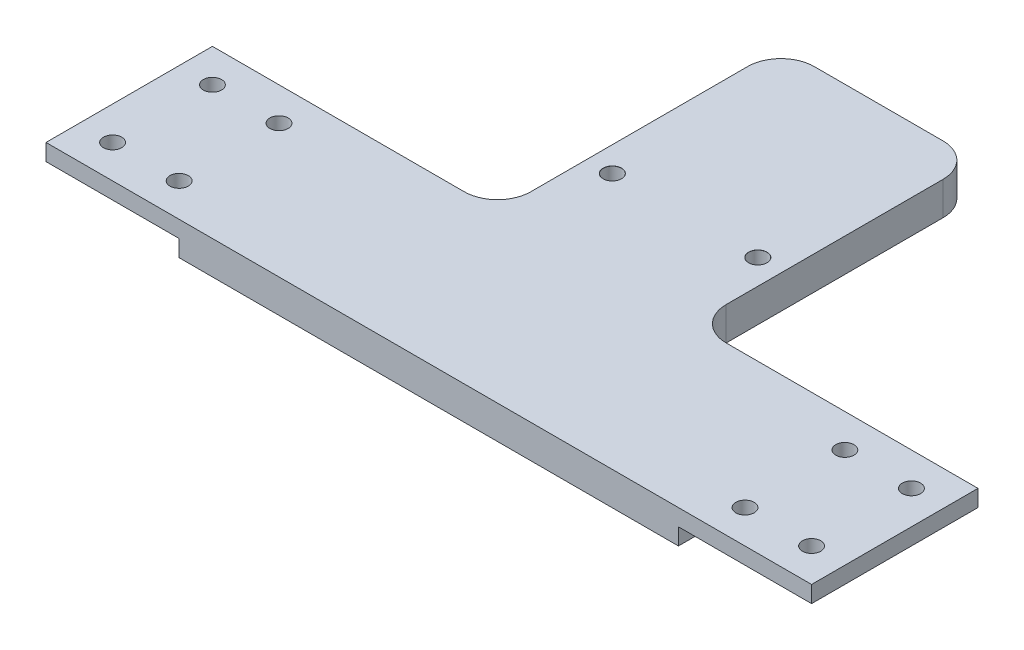
ISO-10303-21;
HEADER;
FILE_DESCRIPTION(('STEP AP214'),'2;1');
FILE_NAME('part.step','',(''),(''),'','','');
FILE_SCHEMA(('AUTOMOTIVE_DESIGN { 1 0 10303 214 1 1 1 1 }'));
ENDSEC;
DATA;
#1=APPLICATION_CONTEXT('core data for automotive mechanical design processes');
#2=APPLICATION_PROTOCOL_DEFINITION('international standard','automotive_design',2000,#1);
#3=PRODUCT_CONTEXT('',#1,'mechanical');
#4=PRODUCT('Part','Part','',(#3));
#5=PRODUCT_RELATED_PRODUCT_CATEGORY('part','',(#4));
#6=PRODUCT_DEFINITION_FORMATION('','',#4);
#7=PRODUCT_DEFINITION_CONTEXT('part definition',#1,'design');
#8=PRODUCT_DEFINITION('design','',#6,#7);
#9=PRODUCT_DEFINITION_SHAPE('','',#8);
#10=(LENGTH_UNIT() NAMED_UNIT(*) SI_UNIT(.MILLI.,.METRE.));
#11=(NAMED_UNIT(*) PLANE_ANGLE_UNIT() SI_UNIT($,.RADIAN.));
#12=(NAMED_UNIT(*) SI_UNIT($,.STERADIAN.) SOLID_ANGLE_UNIT());
#13=UNCERTAINTY_MEASURE_WITH_UNIT(LENGTH_MEASURE(1.E-05),#10,'distance_accuracy_value','');
#14=(GEOMETRIC_REPRESENTATION_CONTEXT(3) GLOBAL_UNCERTAINTY_ASSIGNED_CONTEXT((#13)) GLOBAL_UNIT_ASSIGNED_CONTEXT((#10,
#11,#12)) REPRESENTATION_CONTEXT('',''));
#15=CARTESIAN_POINT('',(0.,0.,0.));
#16=DIRECTION('',(0.,0.,1.));
#17=DIRECTION('',(1.,0.,0.));
#18=AXIS2_PLACEMENT_3D('',#15,#16,#17);
#19=CARTESIAN_POINT('',(-115.,10.,0.));
#20=DIRECTION('',(1.,0.,0.));
#21=DIRECTION('',(0.,0.,-1.));
#22=AXIS2_PLACEMENT_3D('',#19,#20,#21);
#23=PLANE('',#22);
#24=DIRECTION('',(0.,0.,-1.));
#25=VECTOR('',#24,1.);
#26=CARTESIAN_POINT('',(-115.,5.,25.));
#27=LINE('',#26,#25);
#28=CARTESIAN_POINT('',(-115.,5.,25.));
#29=VERTEX_POINT('',#28);
#30=CARTESIAN_POINT('',(-115.,5.,-25.));
#31=VERTEX_POINT('',#30);
#32=EDGE_CURVE('E155',#29,#31,#27,.T.);
#33=ORIENTED_EDGE('',*,*,#32,.F.);
#34=DIRECTION('',(0.,-1.,0.));
#35=VECTOR('',#34,1.);
#36=CARTESIAN_POINT('',(-115.,10.,25.));
#37=LINE('',#36,#35);
#38=CARTESIAN_POINT('',(-115.,10.,25.));
#39=VERTEX_POINT('',#38);
#40=EDGE_CURVE('E181',#39,#29,#37,.T.);
#41=ORIENTED_EDGE('',*,*,#40,.F.);
#42=DIRECTION('',(0.,0.,1.));
#43=VECTOR('',#42,1.);
#44=CARTESIAN_POINT('',(-115.,10.,0.));
#45=LINE('',#44,#43);
#46=CARTESIAN_POINT('',(-115.,10.,-25.));
#47=VERTEX_POINT('',#46);
#48=EDGE_CURVE('E178',#47,#39,#45,.T.);
#49=ORIENTED_EDGE('',*,*,#48,.F.);
#50=DIRECTION('',(0.,-1.,0.));
#51=VECTOR('',#50,1.);
#52=CARTESIAN_POINT('',(-115.,10.,-25.));
#53=LINE('',#52,#51);
#54=EDGE_CURVE('E172',#47,#31,#53,.T.);
#55=ORIENTED_EDGE('',*,*,#54,.T.);
#56=EDGE_LOOP('',(#33,#41,#49,#55));
#57=FACE_BOUND('',#56,.T.);
#58=ADVANCED_FACE('F41',(#57),#23,.F.);
#59=CARTESIAN_POINT('',(-29.35,10.,0.));
#60=DIRECTION('',(-1.,0.,0.));
#61=DIRECTION('',(0.,0.,1.));
#62=AXIS2_PLACEMENT_3D('',#59,#60,#61);
#63=PLANE('',#62);
#64=DIRECTION('',(0.,0.,-1.));
#65=VECTOR('',#64,1.);
#66=CARTESIAN_POINT('',(-29.35,0.,0.));
#67=LINE('',#66,#65);
#68=CARTESIAN_POINT('',(-29.35,0.,-35.));
#69=VERTEX_POINT('',#68);
#70=CARTESIAN_POINT('',(-29.35,0.,-100.15));
#71=VERTEX_POINT('',#70);
#72=EDGE_CURVE('E257',#69,#71,#67,.T.);
#73=ORIENTED_EDGE('',*,*,#72,.F.);
#74=DIRECTION('',(0.,-1.,0.));
#75=VECTOR('',#74,1.);
#76=CARTESIAN_POINT('',(-29.35,10.,-35.));
#77=LINE('',#76,#75);
#78=CARTESIAN_POINT('',(-29.35,10.,-35.));
#79=VERTEX_POINT('',#78);
#80=EDGE_CURVE('E192',#69,#79,#77,.F.);
#81=ORIENTED_EDGE('',*,*,#80,.T.);
#82=DIRECTION('',(0.,0.,-1.));
#83=VECTOR('',#82,1.);
#84=CARTESIAN_POINT('',(-29.35,10.,0.));
#85=LINE('',#84,#83);
#86=CARTESIAN_POINT('',(-29.35,10.,-100.15));
#87=VERTEX_POINT('',#86);
#88=EDGE_CURVE('E267',#79,#87,#85,.T.);
#89=ORIENTED_EDGE('',*,*,#88,.T.);
#90=DIRECTION('',(0.,-1.,0.));
#91=VECTOR('',#90,1.);
#92=CARTESIAN_POINT('',(-29.35,10.,-100.15));
#93=LINE('',#92,#91);
#94=EDGE_CURVE('E184',#87,#71,#93,.T.);
#95=ORIENTED_EDGE('',*,*,#94,.T.);
#96=EDGE_LOOP('',(#73,#81,#89,#95));
#97=FACE_BOUND('',#96,.T.);
#98=ADVANCED_FACE('F339',(#97),#63,.T.);
#99=CARTESIAN_POINT('',(0.,10.,-25.));
#100=DIRECTION('',(0.,0.,-1.));
#101=DIRECTION('',(-1.,0.,0.));
#102=AXIS2_PLACEMENT_3D('',#99,#100,#101);
#103=PLANE('',#102);
#104=DIRECTION('',(1.,0.,0.));
#105=VECTOR('',#104,1.);
#106=CARTESIAN_POINT('',(0.,10.,-25.));
#107=LINE('',#106,#105);
#108=CARTESIAN_POINT('',(-39.35,10.,-25.));
#109=VERTEX_POINT('',#108);
#110=EDGE_CURVE('E253',#47,#109,#107,.T.);
#111=ORIENTED_EDGE('',*,*,#110,.T.);
#112=DIRECTION('',(0.,-1.,0.));
#113=VECTOR('',#112,1.);
#114=CARTESIAN_POINT('',(-39.35,0.,-25.));
#115=LINE('',#114,#113);
#116=CARTESIAN_POINT('',(-39.35,0.,-25.));
#117=VERTEX_POINT('',#116);
#118=EDGE_CURVE('E180',#109,#117,#115,.T.);
#119=ORIENTED_EDGE('',*,*,#118,.T.);
#120=DIRECTION('',(1.,0.,0.));
#121=VECTOR('',#120,1.);
#122=CARTESIAN_POINT('',(0.,0.,-25.));
#123=LINE('',#122,#121);
#124=CARTESIAN_POINT('',(-75.,0.,-25.));
#125=VERTEX_POINT('',#124);
#126=EDGE_CURVE('E236',#125,#117,#123,.T.);
#127=ORIENTED_EDGE('',*,*,#126,.F.);
#128=DIRECTION('',(0.,-1.,0.));
#129=VECTOR('',#128,1.);
#130=CARTESIAN_POINT('',(-75.,5.,-25.));
#131=LINE('',#130,#129);
#132=CARTESIAN_POINT('',(-75.,5.,-25.));
#133=VERTEX_POINT('',#132);
#134=EDGE_CURVE('E175',#133,#125,#131,.T.);
#135=ORIENTED_EDGE('',*,*,#134,.F.);
#136=DIRECTION('',(1.,0.,0.));
#137=VECTOR('',#136,1.);
#138=CARTESIAN_POINT('',(-115.,5.,-25.));
#139=LINE('',#138,#137);
#140=EDGE_CURVE('E159',#31,#133,#139,.T.);
#141=ORIENTED_EDGE('',*,*,#140,.F.);
#142=ORIENTED_EDGE('',*,*,#54,.F.);
#143=EDGE_LOOP('',(#111,#119,#127,#135,#141,#142));
#144=FACE_BOUND('',#143,.T.);
#145=ADVANCED_FACE('F171',(#144),#103,.T.);
#146=CARTESIAN_POINT('',(0.,10.,25.));
#147=DIRECTION('',(0.,0.,-1.));
#148=DIRECTION('',(-1.,0.,0.));
#149=AXIS2_PLACEMENT_3D('',#146,#147,#148);
#150=PLANE('',#149);
#151=DIRECTION('',(-1.,0.,0.));
#152=VECTOR('',#151,1.);
#153=CARTESIAN_POINT('',(-115.,5.,25.));
#154=LINE('',#153,#152);
#155=CARTESIAN_POINT('',(-75.,5.,25.));
#156=VERTEX_POINT('',#155);
#157=EDGE_CURVE('E162',#156,#29,#154,.T.);
#158=ORIENTED_EDGE('',*,*,#157,.F.);
#159=DIRECTION('',(0.,-1.,0.));
#160=VECTOR('',#159,1.);
#161=CARTESIAN_POINT('',(-75.,5.,25.));
#162=LINE('',#161,#160);
#163=CARTESIAN_POINT('',(-75.,0.,25.));
#164=VERTEX_POINT('',#163);
#165=EDGE_CURVE('E300',#156,#164,#162,.T.);
#166=ORIENTED_EDGE('',*,*,#165,.T.);
#167=DIRECTION('',(1.,0.,0.));
#168=VECTOR('',#167,1.);
#169=CARTESIAN_POINT('',(0.,0.,25.));
#170=LINE('',#169,#168);
#171=CARTESIAN_POINT('',(75.,0.,25.));
#172=VERTEX_POINT('',#171);
#173=EDGE_CURVE('E234',#164,#172,#170,.T.);
#174=ORIENTED_EDGE('',*,*,#173,.T.);
#175=DIRECTION('',(0.,-1.,0.));
#176=VECTOR('',#175,1.);
#177=CARTESIAN_POINT('',(75.,5.,25.));
#178=LINE('',#177,#176);
#179=CARTESIAN_POINT('',(75.,5.,25.));
#180=VERTEX_POINT('',#179);
#181=EDGE_CURVE('E285',#180,#172,#178,.T.);
#182=ORIENTED_EDGE('',*,*,#181,.F.);
#183=DIRECTION('',(-1.,0.,0.));
#184=VECTOR('',#183,1.);
#185=CARTESIAN_POINT('',(115.,5.,25.));
#186=LINE('',#185,#184);
#187=CARTESIAN_POINT('',(115.,5.,25.));
#188=VERTEX_POINT('',#187);
#189=EDGE_CURVE('E284',#188,#180,#186,.T.);
#190=ORIENTED_EDGE('',*,*,#189,.F.);
#191=DIRECTION('',(0.,-1.,0.));
#192=VECTOR('',#191,1.);
#193=CARTESIAN_POINT('',(115.,10.,25.));
#194=LINE('',#193,#192);
#195=CARTESIAN_POINT('',(115.,10.,25.));
#196=VERTEX_POINT('',#195);
#197=EDGE_CURVE('E186',#196,#188,#194,.T.);
#198=ORIENTED_EDGE('',*,*,#197,.F.);
#199=DIRECTION('',(1.,0.,0.));
#200=VECTOR('',#199,1.);
#201=CARTESIAN_POINT('',(0.,10.,25.));
#202=LINE('',#201,#200);
#203=EDGE_CURVE('E281',#39,#196,#202,.T.);
#204=ORIENTED_EDGE('',*,*,#203,.F.);
#205=ORIENTED_EDGE('',*,*,#40,.T.);
#206=EDGE_LOOP('',(#158,#166,#174,#182,#190,#198,#204,#205));
#207=FACE_BOUND('',#206,.T.);
#208=ADVANCED_FACE('F280',(#207),#150,.F.);
#209=CARTESIAN_POINT('',(115.,10.,0.));
#210=DIRECTION('',(1.,0.,0.));
#211=DIRECTION('',(0.,0.,-1.));
#212=AXIS2_PLACEMENT_3D('',#209,#210,#211);
#213=PLANE('',#212);
#214=DIRECTION('',(0.,0.,1.));
#215=VECTOR('',#214,1.);
#216=CARTESIAN_POINT('',(115.,5.,25.));
#217=LINE('',#216,#215);
#218=CARTESIAN_POINT('',(115.,5.,-25.));
#219=VERTEX_POINT('',#218);
#220=EDGE_CURVE('E276',#219,#188,#217,.T.);
#221=ORIENTED_EDGE('',*,*,#220,.F.);
#222=DIRECTION('',(0.,-1.,0.));
#223=VECTOR('',#222,1.);
#224=CARTESIAN_POINT('',(115.,10.,-25.));
#225=LINE('',#224,#223);
#226=CARTESIAN_POINT('',(115.,10.,-25.));
#227=VERTEX_POINT('',#226);
#228=EDGE_CURVE('E249',#227,#219,#225,.T.);
#229=ORIENTED_EDGE('',*,*,#228,.F.);
#230=DIRECTION('',(0.,0.,1.));
#231=VECTOR('',#230,1.);
#232=CARTESIAN_POINT('',(115.,10.,0.));
#233=LINE('',#232,#231);
#234=EDGE_CURVE('E251',#227,#196,#233,.T.);
#235=ORIENTED_EDGE('',*,*,#234,.T.);
#236=ORIENTED_EDGE('',*,*,#197,.T.);
#237=EDGE_LOOP('',(#221,#229,#235,#236));
#238=FACE_BOUND('',#237,.T.);
#239=ADVANCED_FACE('F274',(#238),#213,.T.);
#240=CARTESIAN_POINT('',(39.35,0.,-25.));
#241=VERTEX_POINT('',#240);
#242=CARTESIAN_POINT('',(75.,0.,-25.));
#243=VERTEX_POINT('',#242);
#244=EDGE_CURVE('E221',#241,#243,#123,.T.);
#245=ORIENTED_EDGE('',*,*,#244,.F.);
#246=DIRECTION('',(0.,-1.,0.));
#247=VECTOR('',#246,1.);
#248=CARTESIAN_POINT('',(39.35,10.,-25.));
#249=LINE('',#248,#247);
#250=CARTESIAN_POINT('',(39.35,10.,-25.));
#251=VERTEX_POINT('',#250);
#252=EDGE_CURVE('E199',#241,#251,#249,.F.);
#253=ORIENTED_EDGE('',*,*,#252,.T.);
#254=EDGE_CURVE('E243',#251,#227,#107,.T.);
#255=ORIENTED_EDGE('',*,*,#254,.T.);
#256=ORIENTED_EDGE('',*,*,#228,.T.);
#257=DIRECTION('',(1.,0.,0.));
#258=VECTOR('',#257,1.);
#259=CARTESIAN_POINT('',(115.,5.,-25.));
#260=LINE('',#259,#258);
#261=CARTESIAN_POINT('',(75.,5.,-25.));
#262=VERTEX_POINT('',#261);
#263=EDGE_CURVE('E292',#262,#219,#260,.T.);
#264=ORIENTED_EDGE('',*,*,#263,.F.);
#265=DIRECTION('',(0.,-1.,0.));
#266=VECTOR('',#265,1.);
#267=CARTESIAN_POINT('',(75.,5.,-25.));
#268=LINE('',#267,#266);
#269=EDGE_CURVE('E233',#262,#243,#268,.T.);
#270=ORIENTED_EDGE('',*,*,#269,.T.);
#271=EDGE_LOOP('',(#245,#253,#255,#256,#264,#270));
#272=FACE_BOUND('',#271,.T.);
#273=ADVANCED_FACE('F230',(#272),#103,.T.);
#274=CARTESIAN_POINT('',(29.35,10.,0.));
#275=DIRECTION('',(-1.,0.,0.));
#276=DIRECTION('',(0.,0.,1.));
#277=AXIS2_PLACEMENT_3D('',#274,#275,#276);
#278=PLANE('',#277);
#279=DIRECTION('',(0.,0.,-1.));
#280=VECTOR('',#279,1.);
#281=CARTESIAN_POINT('',(29.35,10.,0.));
#282=LINE('',#281,#280);
#283=CARTESIAN_POINT('',(29.35,10.,-35.));
#284=VERTEX_POINT('',#283);
#285=CARTESIAN_POINT('',(29.35,10.,-100.15));
#286=VERTEX_POINT('',#285);
#287=EDGE_CURVE('E241',#284,#286,#282,.T.);
#288=ORIENTED_EDGE('',*,*,#287,.F.);
#289=DIRECTION('',(0.,-1.,0.));
#290=VECTOR('',#289,1.);
#291=CARTESIAN_POINT('',(29.35,10.,-35.));
#292=LINE('',#291,#290);
#293=CARTESIAN_POINT('',(29.35,0.,-35.));
#294=VERTEX_POINT('',#293);
#295=EDGE_CURVE('E196',#284,#294,#292,.T.);
#296=ORIENTED_EDGE('',*,*,#295,.T.);
#297=DIRECTION('',(0.,0.,-1.));
#298=VECTOR('',#297,1.);
#299=CARTESIAN_POINT('',(29.35,0.,0.));
#300=LINE('',#299,#298);
#301=CARTESIAN_POINT('',(29.35,0.,-100.15));
#302=VERTEX_POINT('',#301);
#303=EDGE_CURVE('E224',#294,#302,#300,.T.);
#304=ORIENTED_EDGE('',*,*,#303,.T.);
#305=DIRECTION('',(0.,-1.,0.));
#306=VECTOR('',#305,1.);
#307=CARTESIAN_POINT('',(29.35,10.,-100.15));
#308=LINE('',#307,#306);
#309=EDGE_CURVE('E194',#302,#286,#308,.F.);
#310=ORIENTED_EDGE('',*,*,#309,.T.);
#311=EDGE_LOOP('',(#288,#296,#304,#310));
#312=FACE_BOUND('',#311,.T.);
#313=ADVANCED_FACE('F245',(#312),#278,.F.);
#314=CARTESIAN_POINT('',(0.,10.,-110.15));
#315=DIRECTION('',(0.,0.,-1.));
#316=DIRECTION('',(-1.,0.,0.));
#317=AXIS2_PLACEMENT_3D('',#314,#315,#316);
#318=PLANE('',#317);
#319=DIRECTION('',(1.,0.,0.));
#320=VECTOR('',#319,1.);
#321=CARTESIAN_POINT('',(0.,10.,-110.15));
#322=LINE('',#321,#320);
#323=CARTESIAN_POINT('',(-19.35,10.,-110.15));
#324=VERTEX_POINT('',#323);
#325=CARTESIAN_POINT('',(19.35,10.,-110.15));
#326=VERTEX_POINT('',#325);
#327=EDGE_CURVE('E247',#324,#326,#322,.T.);
#328=ORIENTED_EDGE('',*,*,#327,.T.);
#329=DIRECTION('',(0.,-1.,0.));
#330=VECTOR('',#329,1.);
#331=CARTESIAN_POINT('',(19.35,0.,-110.15));
#332=LINE('',#331,#330);
#333=CARTESIAN_POINT('',(19.35,0.,-110.15));
#334=VERTEX_POINT('',#333);
#335=EDGE_CURVE('E202',#326,#334,#332,.T.);
#336=ORIENTED_EDGE('',*,*,#335,.T.);
#337=DIRECTION('',(1.,0.,0.));
#338=VECTOR('',#337,1.);
#339=CARTESIAN_POINT('',(0.,0.,-110.15));
#340=LINE('',#339,#338);
#341=CARTESIAN_POINT('',(-19.35,0.,-110.15));
#342=VERTEX_POINT('',#341);
#343=EDGE_CURVE('E265',#342,#334,#340,.T.);
#344=ORIENTED_EDGE('',*,*,#343,.F.);
#345=DIRECTION('',(0.,-1.,0.));
#346=VECTOR('',#345,1.);
#347=CARTESIAN_POINT('',(-19.35,10.,-110.15));
#348=LINE('',#347,#346);
#349=EDGE_CURVE('E63',#342,#324,#348,.F.);
#350=ORIENTED_EDGE('',*,*,#349,.T.);
#351=EDGE_LOOP('',(#328,#336,#344,#350));
#352=FACE_BOUND('',#351,.T.);
#353=ADVANCED_FACE('F344',(#352),#318,.T.);
#354=CARTESIAN_POINT('',(0.,10.,0.));
#355=DIRECTION('',(0.,1.,0.));
#356=DIRECTION('',(0.,0.,1.));
#357=AXIS2_PLACEMENT_3D('',#354,#355,#356);
#358=PLANE('',#357);
#359=CARTESIAN_POINT('',(85.,10.,15.));
#360=DIRECTION('',(0.,-1.,0.));
#361=DIRECTION('',(0.,0.,-1.));
#362=AXIS2_PLACEMENT_3D('',#359,#360,#361);
#363=CIRCLE('',#362,2.74999999999999);
#364=CARTESIAN_POINT('',(85.,10.,12.25));
#365=VERTEX_POINT('',#364);
#366=EDGE_CURVE('E724',#365,#365,#363,.T.);
#367=ORIENTED_EDGE('',*,*,#366,.T.);
#368=EDGE_LOOP('',(#367));
#369=FACE_BOUND('',#368,.T.);
#370=CARTESIAN_POINT('',(85.,10.,-15.));
#371=DIRECTION('',(0.,-1.,0.));
#372=DIRECTION('',(0.,0.,-1.));
#373=AXIS2_PLACEMENT_3D('',#370,#371,#372);
#374=CIRCLE('',#373,2.74999999999999);
#375=CARTESIAN_POINT('',(85.,10.,-17.75));
#376=VERTEX_POINT('',#375);
#377=EDGE_CURVE('E728',#376,#376,#374,.T.);
#378=ORIENTED_EDGE('',*,*,#377,.T.);
#379=EDGE_LOOP('',(#378));
#380=FACE_BOUND('',#379,.T.);
#381=CARTESIAN_POINT('',(105.,10.,15.));
#382=DIRECTION('',(0.,-1.,0.));
#383=DIRECTION('',(0.,0.,-1.));
#384=AXIS2_PLACEMENT_3D('',#381,#382,#383);
#385=CIRCLE('',#384,2.74999999999997);
#386=CARTESIAN_POINT('',(105.,10.,12.25));
#387=VERTEX_POINT('',#386);
#388=EDGE_CURVE('E732',#387,#387,#385,.T.);
#389=ORIENTED_EDGE('',*,*,#388,.T.);
#390=EDGE_LOOP('',(#389));
#391=FACE_BOUND('',#390,.T.);
#392=CARTESIAN_POINT('',(105.,10.,-15.));
#393=DIRECTION('',(0.,-1.,0.));
#394=DIRECTION('',(0.,0.,-1.));
#395=AXIS2_PLACEMENT_3D('',#392,#393,#394);
#396=CIRCLE('',#395,2.74999999999997);
#397=CARTESIAN_POINT('',(105.,10.,-17.75));
#398=VERTEX_POINT('',#397);
#399=EDGE_CURVE('E736',#398,#398,#396,.T.);
#400=ORIENTED_EDGE('',*,*,#399,.T.);
#401=EDGE_LOOP('',(#400));
#402=FACE_BOUND('',#401,.T.);
#403=CARTESIAN_POINT('',(-105.,10.,15.));
#404=DIRECTION('',(0.,-1.,0.));
#405=DIRECTION('',(0.,0.,-1.));
#406=AXIS2_PLACEMENT_3D('',#403,#404,#405);
#407=CIRCLE('',#406,2.74999999999997);
#408=CARTESIAN_POINT('',(-105.,10.,12.25));
#409=VERTEX_POINT('',#408);
#410=EDGE_CURVE('E740',#409,#409,#407,.T.);
#411=ORIENTED_EDGE('',*,*,#410,.T.);
#412=EDGE_LOOP('',(#411));
#413=FACE_BOUND('',#412,.T.);
#414=CARTESIAN_POINT('',(-105.,10.,-15.));
#415=DIRECTION('',(0.,-1.,0.));
#416=DIRECTION('',(0.,0.,-1.));
#417=AXIS2_PLACEMENT_3D('',#414,#415,#416);
#418=CIRCLE('',#417,2.74999999999997);
#419=CARTESIAN_POINT('',(-105.,10.,-17.75));
#420=VERTEX_POINT('',#419);
#421=EDGE_CURVE('E744',#420,#420,#418,.T.);
#422=ORIENTED_EDGE('',*,*,#421,.T.);
#423=EDGE_LOOP('',(#422));
#424=FACE_BOUND('',#423,.T.);
#425=CARTESIAN_POINT('',(-85.,10.,15.));
#426=DIRECTION('',(0.,-1.,0.));
#427=DIRECTION('',(0.,0.,-1.));
#428=AXIS2_PLACEMENT_3D('',#425,#426,#427);
#429=CIRCLE('',#428,2.74999999999999);
#430=CARTESIAN_POINT('',(-85.,10.,12.25));
#431=VERTEX_POINT('',#430);
#432=EDGE_CURVE('E748',#431,#431,#429,.T.);
#433=ORIENTED_EDGE('',*,*,#432,.T.);
#434=EDGE_LOOP('',(#433));
#435=FACE_BOUND('',#434,.T.);
#436=CARTESIAN_POINT('',(-85.,10.,-15.));
#437=DIRECTION('',(0.,-1.,0.));
#438=DIRECTION('',(0.,0.,-1.));
#439=AXIS2_PLACEMENT_3D('',#436,#437,#438);
#440=CIRCLE('',#439,2.74999999999999);
#441=CARTESIAN_POINT('',(-85.,10.,-17.75));
#442=VERTEX_POINT('',#441);
#443=EDGE_CURVE('E326',#442,#442,#440,.T.);
#444=ORIENTED_EDGE('',*,*,#443,.T.);
#445=EDGE_LOOP('',(#444));
#446=FACE_BOUND('',#445,.T.);
#447=CARTESIAN_POINT('',(-21.85,10.,-52.));
#448=DIRECTION('',(0.,1.,0.));
#449=DIRECTION('',(0.,0.,1.));
#450=AXIS2_PLACEMENT_3D('',#447,#448,#449);
#451=CIRCLE('',#450,2.775);
#452=CARTESIAN_POINT('',(-21.85,10.,-49.225));
#453=VERTEX_POINT('',#452);
#454=EDGE_CURVE('E296',#453,#453,#451,.T.);
#455=ORIENTED_EDGE('',*,*,#454,.F.);
#456=EDGE_LOOP('',(#455));
#457=FACE_BOUND('',#456,.T.);
#458=CARTESIAN_POINT('',(21.85,10.,-52.));
#459=DIRECTION('',(0.,1.,0.));
#460=DIRECTION('',(0.,0.,1.));
#461=AXIS2_PLACEMENT_3D('',#458,#459,#460);
#462=CIRCLE('',#461,2.775);
#463=CARTESIAN_POINT('',(21.85,10.,-49.225));
#464=VERTEX_POINT('',#463);
#465=EDGE_CURVE('E306',#464,#464,#462,.T.);
#466=ORIENTED_EDGE('',*,*,#465,.F.);
#467=EDGE_LOOP('',(#466));
#468=FACE_BOUND('',#467,.T.);
#469=ORIENTED_EDGE('',*,*,#287,.T.);
#470=CARTESIAN_POINT('',(19.35,10.,-100.15));
#471=DIRECTION('',(0.,1.,0.));
#472=DIRECTION('',(0.,0.,1.));
#473=AXIS2_PLACEMENT_3D('',#470,#471,#472);
#474=CIRCLE('',#473,10.);
#475=EDGE_CURVE('E56',#286,#326,#474,.T.);
#476=ORIENTED_EDGE('',*,*,#475,.T.);
#477=ORIENTED_EDGE('',*,*,#327,.F.);
#478=CARTESIAN_POINT('',(-19.35,10.,-100.15));
#479=DIRECTION('',(0.,1.,0.));
#480=DIRECTION('',(0.,0.,1.));
#481=AXIS2_PLACEMENT_3D('',#478,#479,#480);
#482=CIRCLE('',#481,10.);
#483=EDGE_CURVE('E209',#324,#87,#482,.T.);
#484=ORIENTED_EDGE('',*,*,#483,.T.);
#485=ORIENTED_EDGE('',*,*,#88,.F.);
#486=CARTESIAN_POINT('',(-39.35,10.,-35.));
#487=DIRECTION('',(0.,1.,0.));
#488=DIRECTION('',(0.,0.,1.));
#489=AXIS2_PLACEMENT_3D('',#486,#487,#488);
#490=CIRCLE('',#489,10.);
#491=EDGE_CURVE('E214',#79,#109,#490,.F.);
#492=ORIENTED_EDGE('',*,*,#491,.T.);
#493=ORIENTED_EDGE('',*,*,#110,.F.);
#494=ORIENTED_EDGE('',*,*,#48,.T.);
#495=ORIENTED_EDGE('',*,*,#203,.T.);
#496=ORIENTED_EDGE('',*,*,#234,.F.);
#497=ORIENTED_EDGE('',*,*,#254,.F.);
#498=CARTESIAN_POINT('',(39.35,10.,-35.));
#499=DIRECTION('',(0.,1.,0.));
#500=DIRECTION('',(0.,0.,1.));
#501=AXIS2_PLACEMENT_3D('',#498,#499,#500);
#502=CIRCLE('',#501,10.);
#503=EDGE_CURVE('E11',#251,#284,#502,.F.);
#504=ORIENTED_EDGE('',*,*,#503,.T.);
#505=EDGE_LOOP('',(#469,#476,#477,#484,#485,#492,#493,#494,#495,#496,#497,#504));
#506=FACE_BOUND('',#505,.T.);
#507=ADVANCED_FACE('F240',(#369,#380,#391,#402,#413,#424,#435,#446,#457,#468,#506),#358,.T.);
#508=CARTESIAN_POINT('',(0.,0.,0.));
#509=DIRECTION('',(0.,1.,0.));
#510=DIRECTION('',(0.,0.,1.));
#511=AXIS2_PLACEMENT_3D('',#508,#509,#510);
#512=PLANE('',#511);
#513=CARTESIAN_POINT('',(-21.85,0.,-52.));
#514=DIRECTION('',(0.,1.,0.));
#515=DIRECTION('',(0.,0.,1.));
#516=AXIS2_PLACEMENT_3D('',#513,#514,#515);
#517=CIRCLE('',#516,2.75);
#518=CARTESIAN_POINT('',(-21.85,0.,-49.25));
#519=VERTEX_POINT('',#518);
#520=EDGE_CURVE('E303',#519,#519,#517,.T.);
#521=ORIENTED_EDGE('',*,*,#520,.T.);
#522=EDGE_LOOP('',(#521));
#523=FACE_BOUND('',#522,.T.);
#524=CARTESIAN_POINT('',(21.85,0.,-52.));
#525=DIRECTION('',(0.,1.,0.));
#526=DIRECTION('',(0.,0.,1.));
#527=AXIS2_PLACEMENT_3D('',#524,#525,#526);
#528=CIRCLE('',#527,2.75);
#529=CARTESIAN_POINT('',(21.85,0.,-49.25));
#530=VERTEX_POINT('',#529);
#531=EDGE_CURVE('E259',#530,#530,#528,.T.);
#532=ORIENTED_EDGE('',*,*,#531,.T.);
#533=EDGE_LOOP('',(#532));
#534=FACE_BOUND('',#533,.T.);
#535=ORIENTED_EDGE('',*,*,#343,.T.);
#536=CARTESIAN_POINT('',(19.35,0.,-100.15));
#537=DIRECTION('',(0.,1.,0.));
#538=DIRECTION('',(0.,0.,1.));
#539=AXIS2_PLACEMENT_3D('',#536,#537,#538);
#540=CIRCLE('',#539,10.);
#541=EDGE_CURVE('E207',#334,#302,#540,.F.);
#542=ORIENTED_EDGE('',*,*,#541,.T.);
#543=ORIENTED_EDGE('',*,*,#303,.F.);
#544=CARTESIAN_POINT('',(39.35,0.,-35.));
#545=DIRECTION('',(0.,1.,0.));
#546=DIRECTION('',(0.,0.,1.));
#547=AXIS2_PLACEMENT_3D('',#544,#545,#546);
#548=CIRCLE('',#547,10.);
#549=EDGE_CURVE('E49',#294,#241,#548,.T.);
#550=ORIENTED_EDGE('',*,*,#549,.T.);
#551=ORIENTED_EDGE('',*,*,#244,.T.);
#552=DIRECTION('',(0.,0.,-1.));
#553=VECTOR('',#552,1.);
#554=CARTESIAN_POINT('',(75.,0.,25.));
#555=LINE('',#554,#553);
#556=EDGE_CURVE('E290',#172,#243,#555,.T.);
#557=ORIENTED_EDGE('',*,*,#556,.F.);
#558=ORIENTED_EDGE('',*,*,#173,.F.);
#559=DIRECTION('',(0.,0.,1.));
#560=VECTOR('',#559,1.);
#561=CARTESIAN_POINT('',(-75.,0.,25.));
#562=LINE('',#561,#560);
#563=EDGE_CURVE('E167',#125,#164,#562,.T.);
#564=ORIENTED_EDGE('',*,*,#563,.F.);
#565=ORIENTED_EDGE('',*,*,#126,.T.);
#566=CARTESIAN_POINT('',(-39.35,0.,-35.));
#567=DIRECTION('',(0.,1.,0.));
#568=DIRECTION('',(0.,0.,1.));
#569=AXIS2_PLACEMENT_3D('',#566,#567,#568);
#570=CIRCLE('',#569,10.);
#571=EDGE_CURVE('E212',#117,#69,#570,.T.);
#572=ORIENTED_EDGE('',*,*,#571,.T.);
#573=ORIENTED_EDGE('',*,*,#72,.T.);
#574=CARTESIAN_POINT('',(-19.35,0.,-100.15));
#575=DIRECTION('',(0.,1.,0.));
#576=DIRECTION('',(0.,0.,1.));
#577=AXIS2_PLACEMENT_3D('',#574,#575,#576);
#578=CIRCLE('',#577,10.);
#579=EDGE_CURVE('E205',#71,#342,#578,.F.);
#580=ORIENTED_EDGE('',*,*,#579,.T.);
#581=EDGE_LOOP('',(#535,#542,#543,#550,#551,#557,#558,#564,#565,#572,#573,#580));
#582=FACE_BOUND('',#581,.T.);
#583=ADVANCED_FACE('F219',(#523,#534,#582),#512,.F.);
#584=CARTESIAN_POINT('',(21.85,10.,-52.));
#585=DIRECTION('',(0.,1.,0.));
#586=DIRECTION('',(0.,0.,1.));
#587=AXIS2_PLACEMENT_3D('',#584,#585,#586);
#588=CYLINDRICAL_SURFACE('',#587,2.75);
#589=ORIENTED_EDGE('',*,*,#531,.F.);
#590=EDGE_LOOP('',(#589));
#591=FACE_BOUND('',#590,.T.);
#592=CARTESIAN_POINT('',(21.85,9.975,-52.));
#593=DIRECTION('',(0.,1.,0.));
#594=DIRECTION('',(0.,0.,1.));
#595=AXIS2_PLACEMENT_3D('',#592,#593,#594);
#596=CIRCLE('',#595,2.75);
#597=CARTESIAN_POINT('',(21.85,9.975,-49.25));
#598=VERTEX_POINT('',#597);
#599=EDGE_CURVE('E309',#598,#598,#596,.T.);
#600=ORIENTED_EDGE('',*,*,#599,.T.);
#601=EDGE_LOOP('',(#600));
#602=FACE_BOUND('',#601,.T.);
#603=ADVANCED_FACE('F459',(#591,#602),#588,.F.);
#604=CARTESIAN_POINT('',(21.85,10.,-52.));
#605=DIRECTION('',(0.,1.,0.));
#606=DIRECTION('',(0.,0.,1.));
#607=AXIS2_PLACEMENT_3D('',#604,#605,#606);
#608=CONICAL_SURFACE('',#607,2.775,0.785398163397448);
#609=ORIENTED_EDGE('',*,*,#599,.F.);
#610=EDGE_LOOP('',(#609));
#611=FACE_BOUND('',#610,.T.);
#612=ORIENTED_EDGE('',*,*,#465,.T.);
#613=EDGE_LOOP('',(#612));
#614=FACE_BOUND('',#613,.T.);
#615=ADVANCED_FACE('F455',(#611,#614),#608,.F.);
#616=CARTESIAN_POINT('',(-21.85,10.,-52.));
#617=DIRECTION('',(0.,1.,0.));
#618=DIRECTION('',(0.,0.,1.));
#619=AXIS2_PLACEMENT_3D('',#616,#617,#618);
#620=CYLINDRICAL_SURFACE('',#619,2.75);
#621=ORIENTED_EDGE('',*,*,#520,.F.);
#622=EDGE_LOOP('',(#621));
#623=FACE_BOUND('',#622,.T.);
#624=CARTESIAN_POINT('',(-21.85,9.975,-52.));
#625=DIRECTION('',(0.,1.,0.));
#626=DIRECTION('',(0.,0.,1.));
#627=AXIS2_PLACEMENT_3D('',#624,#625,#626);
#628=CIRCLE('',#627,2.75);
#629=CARTESIAN_POINT('',(-21.85,9.975,-49.25));
#630=VERTEX_POINT('',#629);
#631=EDGE_CURVE('E299',#630,#630,#628,.T.);
#632=ORIENTED_EDGE('',*,*,#631,.T.);
#633=EDGE_LOOP('',(#632));
#634=FACE_BOUND('',#633,.T.);
#635=ADVANCED_FACE('F451',(#623,#634),#620,.F.);
#636=CARTESIAN_POINT('',(-21.85,10.,-52.));
#637=DIRECTION('',(0.,1.,0.));
#638=DIRECTION('',(0.,0.,1.));
#639=AXIS2_PLACEMENT_3D('',#636,#637,#638);
#640=CONICAL_SURFACE('',#639,2.775,0.785398163397448);
#641=ORIENTED_EDGE('',*,*,#631,.F.);
#642=EDGE_LOOP('',(#641));
#643=FACE_BOUND('',#642,.T.);
#644=ORIENTED_EDGE('',*,*,#454,.T.);
#645=EDGE_LOOP('',(#644));
#646=FACE_BOUND('',#645,.T.);
#647=ADVANCED_FACE('F446',(#643,#646),#640,.F.);
#648=CARTESIAN_POINT('',(75.,5.,25.));
#649=DIRECTION('',(-1.,0.,0.));
#650=DIRECTION('',(0.,0.,1.));
#651=AXIS2_PLACEMENT_3D('',#648,#649,#650);
#652=PLANE('',#651);
#653=ORIENTED_EDGE('',*,*,#556,.T.);
#654=ORIENTED_EDGE('',*,*,#269,.F.);
#655=DIRECTION('',(0.,0.,-1.));
#656=VECTOR('',#655,1.);
#657=CARTESIAN_POINT('',(75.,5.,25.));
#658=LINE('',#657,#656);
#659=EDGE_CURVE('E288',#180,#262,#658,.T.);
#660=ORIENTED_EDGE('',*,*,#659,.F.);
#661=ORIENTED_EDGE('',*,*,#181,.T.);
#662=EDGE_LOOP('',(#653,#654,#660,#661));
#663=FACE_BOUND('',#662,.T.);
#664=ADVANCED_FACE('F329',(#663),#652,.F.);
#665=CARTESIAN_POINT('',(0.,5.,0.));
#666=DIRECTION('',(0.,1.,0.));
#667=DIRECTION('',(0.,0.,1.));
#668=AXIS2_PLACEMENT_3D('',#665,#666,#667);
#669=PLANE('',#668);
#670=CARTESIAN_POINT('',(85.,5.,15.));
#671=DIRECTION('',(0.,-1.,0.));
#672=DIRECTION('',(0.,0.,-1.));
#673=AXIS2_PLACEMENT_3D('',#670,#671,#672);
#674=CIRCLE('',#673,2.775);
#675=CARTESIAN_POINT('',(85.,5.,12.225));
#676=VERTEX_POINT('',#675);
#677=EDGE_CURVE('E805',#676,#676,#674,.T.);
#678=ORIENTED_EDGE('',*,*,#677,.F.);
#679=EDGE_LOOP('',(#678));
#680=FACE_BOUND('',#679,.T.);
#681=CARTESIAN_POINT('',(85.,5.,-15.));
#682=DIRECTION('',(0.,-1.,0.));
#683=DIRECTION('',(0.,0.,-1.));
#684=AXIS2_PLACEMENT_3D('',#681,#682,#683);
#685=CIRCLE('',#684,2.775);
#686=CARTESIAN_POINT('',(85.,5.,-17.775));
#687=VERTEX_POINT('',#686);
#688=EDGE_CURVE('E798',#687,#687,#685,.T.);
#689=ORIENTED_EDGE('',*,*,#688,.F.);
#690=EDGE_LOOP('',(#689));
#691=FACE_BOUND('',#690,.T.);
#692=CARTESIAN_POINT('',(105.,5.,15.));
#693=DIRECTION('',(0.,-1.,0.));
#694=DIRECTION('',(0.,0.,-1.));
#695=AXIS2_PLACEMENT_3D('',#692,#693,#694);
#696=CIRCLE('',#695,2.775);
#697=CARTESIAN_POINT('',(105.,5.,12.225));
#698=VERTEX_POINT('',#697);
#699=EDGE_CURVE('E791',#698,#698,#696,.T.);
#700=ORIENTED_EDGE('',*,*,#699,.F.);
#701=EDGE_LOOP('',(#700));
#702=FACE_BOUND('',#701,.T.);
#703=CARTESIAN_POINT('',(105.,5.,-15.));
#704=DIRECTION('',(0.,-1.,0.));
#705=DIRECTION('',(0.,0.,-1.));
#706=AXIS2_PLACEMENT_3D('',#703,#704,#705);
#707=CIRCLE('',#706,2.775);
#708=CARTESIAN_POINT('',(105.,5.,-17.775));
#709=VERTEX_POINT('',#708);
#710=EDGE_CURVE('E784',#709,#709,#707,.T.);
#711=ORIENTED_EDGE('',*,*,#710,.F.);
#712=EDGE_LOOP('',(#711));
#713=FACE_BOUND('',#712,.T.);
#714=ORIENTED_EDGE('',*,*,#220,.T.);
#715=ORIENTED_EDGE('',*,*,#189,.T.);
#716=ORIENTED_EDGE('',*,*,#659,.T.);
#717=ORIENTED_EDGE('',*,*,#263,.T.);
#718=EDGE_LOOP('',(#714,#715,#716,#717));
#719=FACE_BOUND('',#718,.T.);
#720=ADVANCED_FACE('F327',(#680,#691,#702,#713,#719),#669,.F.);
#721=CARTESIAN_POINT('',(-75.,5.,25.));
#722=DIRECTION('',(1.,0.,0.));
#723=DIRECTION('',(0.,0.,-1.));
#724=AXIS2_PLACEMENT_3D('',#721,#722,#723);
#725=PLANE('',#724);
#726=ORIENTED_EDGE('',*,*,#563,.T.);
#727=ORIENTED_EDGE('',*,*,#165,.F.);
#728=DIRECTION('',(0.,0.,1.));
#729=VECTOR('',#728,1.);
#730=CARTESIAN_POINT('',(-75.,5.,25.));
#731=LINE('',#730,#729);
#732=EDGE_CURVE('E176',#133,#156,#731,.T.);
#733=ORIENTED_EDGE('',*,*,#732,.F.);
#734=ORIENTED_EDGE('',*,*,#134,.T.);
#735=EDGE_LOOP('',(#726,#727,#733,#734));
#736=FACE_BOUND('',#735,.T.);
#737=ADVANCED_FACE('F440',(#736),#725,.F.);
#738=CARTESIAN_POINT('',(0.,5.,0.));
#739=DIRECTION('',(0.,-1.,0.));
#740=DIRECTION('',(0.,0.,-1.));
#741=AXIS2_PLACEMENT_3D('',#738,#739,#740);
#742=PLANE('',#741);
#743=CARTESIAN_POINT('',(-105.,5.,15.));
#744=DIRECTION('',(0.,-1.,0.));
#745=DIRECTION('',(0.,0.,-1.));
#746=AXIS2_PLACEMENT_3D('',#743,#744,#745);
#747=CIRCLE('',#746,2.775);
#748=CARTESIAN_POINT('',(-105.,5.,12.225));
#749=VERTEX_POINT('',#748);
#750=EDGE_CURVE('E777',#749,#749,#747,.T.);
#751=ORIENTED_EDGE('',*,*,#750,.F.);
#752=EDGE_LOOP('',(#751));
#753=FACE_BOUND('',#752,.T.);
#754=CARTESIAN_POINT('',(-105.,5.,-15.));
#755=DIRECTION('',(0.,-1.,0.));
#756=DIRECTION('',(0.,0.,-1.));
#757=AXIS2_PLACEMENT_3D('',#754,#755,#756);
#758=CIRCLE('',#757,2.775);
#759=CARTESIAN_POINT('',(-105.,5.,-17.775));
#760=VERTEX_POINT('',#759);
#761=EDGE_CURVE('E770',#760,#760,#758,.T.);
#762=ORIENTED_EDGE('',*,*,#761,.F.);
#763=EDGE_LOOP('',(#762));
#764=FACE_BOUND('',#763,.T.);
#765=CARTESIAN_POINT('',(-85.,5.,15.));
#766=DIRECTION('',(0.,-1.,0.));
#767=DIRECTION('',(0.,0.,-1.));
#768=AXIS2_PLACEMENT_3D('',#765,#766,#767);
#769=CIRCLE('',#768,2.775);
#770=CARTESIAN_POINT('',(-85.,5.,12.225));
#771=VERTEX_POINT('',#770);
#772=EDGE_CURVE('E763',#771,#771,#769,.T.);
#773=ORIENTED_EDGE('',*,*,#772,.F.);
#774=EDGE_LOOP('',(#773));
#775=FACE_BOUND('',#774,.T.);
#776=CARTESIAN_POINT('',(-85.,5.,-15.));
#777=DIRECTION('',(0.,-1.,0.));
#778=DIRECTION('',(0.,0.,-1.));
#779=AXIS2_PLACEMENT_3D('',#776,#777,#778);
#780=CIRCLE('',#779,2.775);
#781=CARTESIAN_POINT('',(-85.,5.,-17.775));
#782=VERTEX_POINT('',#781);
#783=EDGE_CURVE('E754',#782,#782,#780,.T.);
#784=ORIENTED_EDGE('',*,*,#783,.F.);
#785=EDGE_LOOP('',(#784));
#786=FACE_BOUND('',#785,.T.);
#787=ORIENTED_EDGE('',*,*,#32,.T.);
#788=ORIENTED_EDGE('',*,*,#140,.T.);
#789=ORIENTED_EDGE('',*,*,#732,.T.);
#790=ORIENTED_EDGE('',*,*,#157,.T.);
#791=EDGE_LOOP('',(#787,#788,#789,#790));
#792=FACE_BOUND('',#791,.T.);
#793=ADVANCED_FACE('F157',(#753,#764,#775,#786,#792),#742,.T.);
#794=CARTESIAN_POINT('',(-85.,5.,-15.));
#795=DIRECTION('',(0.,-1.,0.));
#796=DIRECTION('',(0.,0.,-1.));
#797=AXIS2_PLACEMENT_3D('',#794,#795,#796);
#798=CYLINDRICAL_SURFACE('',#797,2.74999999999999);
#799=ORIENTED_EDGE('',*,*,#443,.F.);
#800=EDGE_LOOP('',(#799));
#801=FACE_BOUND('',#800,.T.);
#802=CARTESIAN_POINT('',(-85.,5.025,-15.));
#803=DIRECTION('',(0.,-1.,0.));
#804=DIRECTION('',(0.,0.,-1.));
#805=AXIS2_PLACEMENT_3D('',#802,#803,#804);
#806=CIRCLE('',#805,2.74999999999999);
#807=CARTESIAN_POINT('',(-85.,5.025,-17.75));
#808=VERTEX_POINT('',#807);
#809=EDGE_CURVE('E751',#808,#808,#806,.T.);
#810=ORIENTED_EDGE('',*,*,#809,.T.);
#811=EDGE_LOOP('',(#810));
#812=FACE_BOUND('',#811,.T.);
#813=ADVANCED_FACE('F433',(#801,#812),#798,.F.);
#814=CARTESIAN_POINT('',(-85.,5.,-15.));
#815=DIRECTION('',(0.,-1.,0.));
#816=DIRECTION('',(0.,0.,-1.));
#817=AXIS2_PLACEMENT_3D('',#814,#815,#816);
#818=CONICAL_SURFACE('',#817,2.775,0.785398163397691);
#819=ORIENTED_EDGE('',*,*,#809,.F.);
#820=EDGE_LOOP('',(#819));
#821=FACE_BOUND('',#820,.T.);
#822=ORIENTED_EDGE('',*,*,#783,.T.);
#823=EDGE_LOOP('',(#822));
#824=FACE_BOUND('',#823,.T.);
#825=ADVANCED_FACE('F429',(#821,#824),#818,.F.);
#826=CARTESIAN_POINT('',(-85.,5.,15.));
#827=DIRECTION('',(0.,-1.,0.));
#828=DIRECTION('',(0.,0.,-1.));
#829=AXIS2_PLACEMENT_3D('',#826,#827,#828);
#830=CYLINDRICAL_SURFACE('',#829,2.74999999999999);
#831=ORIENTED_EDGE('',*,*,#432,.F.);
#832=EDGE_LOOP('',(#831));
#833=FACE_BOUND('',#832,.T.);
#834=CARTESIAN_POINT('',(-85.,5.025,15.));
#835=DIRECTION('',(0.,-1.,0.));
#836=DIRECTION('',(0.,0.,-1.));
#837=AXIS2_PLACEMENT_3D('',#834,#835,#836);
#838=CIRCLE('',#837,2.74999999999999);
#839=CARTESIAN_POINT('',(-85.,5.025,12.25));
#840=VERTEX_POINT('',#839);
#841=EDGE_CURVE('E760',#840,#840,#838,.T.);
#842=ORIENTED_EDGE('',*,*,#841,.T.);
#843=EDGE_LOOP('',(#842));
#844=FACE_BOUND('',#843,.T.);
#845=ADVANCED_FACE('F425',(#833,#844),#830,.F.);
#846=CARTESIAN_POINT('',(-85.,5.,15.));
#847=DIRECTION('',(0.,-1.,0.));
#848=DIRECTION('',(0.,0.,-1.));
#849=AXIS2_PLACEMENT_3D('',#846,#847,#848);
#850=CONICAL_SURFACE('',#849,2.775,0.785398163397691);
#851=ORIENTED_EDGE('',*,*,#841,.F.);
#852=EDGE_LOOP('',(#851));
#853=FACE_BOUND('',#852,.T.);
#854=ORIENTED_EDGE('',*,*,#772,.T.);
#855=EDGE_LOOP('',(#854));
#856=FACE_BOUND('',#855,.T.);
#857=ADVANCED_FACE('F421',(#853,#856),#850,.F.);
#858=CARTESIAN_POINT('',(-105.,5.,-15.));
#859=DIRECTION('',(0.,-1.,0.));
#860=DIRECTION('',(0.,0.,-1.));
#861=AXIS2_PLACEMENT_3D('',#858,#859,#860);
#862=CYLINDRICAL_SURFACE('',#861,2.74999999999998);
#863=ORIENTED_EDGE('',*,*,#421,.F.);
#864=EDGE_LOOP('',(#863));
#865=FACE_BOUND('',#864,.T.);
#866=CARTESIAN_POINT('',(-105.,5.025,-15.));
#867=DIRECTION('',(0.,-1.,0.));
#868=DIRECTION('',(0.,0.,-1.));
#869=AXIS2_PLACEMENT_3D('',#866,#867,#868);
#870=CIRCLE('',#869,2.74999999999999);
#871=CARTESIAN_POINT('',(-105.,5.025,-17.75));
#872=VERTEX_POINT('',#871);
#873=EDGE_CURVE('E767',#872,#872,#870,.T.);
#874=ORIENTED_EDGE('',*,*,#873,.T.);
#875=EDGE_LOOP('',(#874));
#876=FACE_BOUND('',#875,.T.);
#877=ADVANCED_FACE('F417',(#865,#876),#862,.F.);
#878=CARTESIAN_POINT('',(-105.,5.,-15.));
#879=DIRECTION('',(0.,-1.,0.));
#880=DIRECTION('',(0.,0.,-1.));
#881=AXIS2_PLACEMENT_3D('',#878,#879,#880);
#882=CONICAL_SURFACE('',#881,2.775,0.785398163397691);
#883=ORIENTED_EDGE('',*,*,#873,.F.);
#884=EDGE_LOOP('',(#883));
#885=FACE_BOUND('',#884,.T.);
#886=ORIENTED_EDGE('',*,*,#761,.T.);
#887=EDGE_LOOP('',(#886));
#888=FACE_BOUND('',#887,.T.);
#889=ADVANCED_FACE('F413',(#885,#888),#882,.F.);
#890=CARTESIAN_POINT('',(-105.,5.,15.));
#891=DIRECTION('',(0.,-1.,0.));
#892=DIRECTION('',(0.,0.,-1.));
#893=AXIS2_PLACEMENT_3D('',#890,#891,#892);
#894=CYLINDRICAL_SURFACE('',#893,2.74999999999998);
#895=ORIENTED_EDGE('',*,*,#410,.F.);
#896=EDGE_LOOP('',(#895));
#897=FACE_BOUND('',#896,.T.);
#898=CARTESIAN_POINT('',(-105.,5.025,15.));
#899=DIRECTION('',(0.,-1.,0.));
#900=DIRECTION('',(0.,0.,-1.));
#901=AXIS2_PLACEMENT_3D('',#898,#899,#900);
#902=CIRCLE('',#901,2.74999999999999);
#903=CARTESIAN_POINT('',(-105.,5.025,12.25));
#904=VERTEX_POINT('',#903);
#905=EDGE_CURVE('E774',#904,#904,#902,.T.);
#906=ORIENTED_EDGE('',*,*,#905,.T.);
#907=EDGE_LOOP('',(#906));
#908=FACE_BOUND('',#907,.T.);
#909=ADVANCED_FACE('F409',(#897,#908),#894,.F.);
#910=CARTESIAN_POINT('',(-105.,5.,15.));
#911=DIRECTION('',(0.,-1.,0.));
#912=DIRECTION('',(0.,0.,-1.));
#913=AXIS2_PLACEMENT_3D('',#910,#911,#912);
#914=CONICAL_SURFACE('',#913,2.775,0.785398163397691);
#915=ORIENTED_EDGE('',*,*,#905,.F.);
#916=EDGE_LOOP('',(#915));
#917=FACE_BOUND('',#916,.T.);
#918=ORIENTED_EDGE('',*,*,#750,.T.);
#919=EDGE_LOOP('',(#918));
#920=FACE_BOUND('',#919,.T.);
#921=ADVANCED_FACE('F405',(#917,#920),#914,.F.);
#922=CARTESIAN_POINT('',(105.,5.,-15.));
#923=DIRECTION('',(0.,-1.,0.));
#924=DIRECTION('',(0.,0.,-1.));
#925=AXIS2_PLACEMENT_3D('',#922,#923,#924);
#926=CYLINDRICAL_SURFACE('',#925,2.74999999999998);
#927=ORIENTED_EDGE('',*,*,#399,.F.);
#928=EDGE_LOOP('',(#927));
#929=FACE_BOUND('',#928,.T.);
#930=CARTESIAN_POINT('',(105.,5.025,-15.));
#931=DIRECTION('',(0.,-1.,0.));
#932=DIRECTION('',(0.,0.,-1.));
#933=AXIS2_PLACEMENT_3D('',#930,#931,#932);
#934=CIRCLE('',#933,2.74999999999999);
#935=CARTESIAN_POINT('',(105.,5.025,-17.75));
#936=VERTEX_POINT('',#935);
#937=EDGE_CURVE('E781',#936,#936,#934,.T.);
#938=ORIENTED_EDGE('',*,*,#937,.T.);
#939=EDGE_LOOP('',(#938));
#940=FACE_BOUND('',#939,.T.);
#941=ADVANCED_FACE('F401',(#929,#940),#926,.F.);
#942=CARTESIAN_POINT('',(105.,5.,-15.));
#943=DIRECTION('',(0.,-1.,0.));
#944=DIRECTION('',(0.,0.,-1.));
#945=AXIS2_PLACEMENT_3D('',#942,#943,#944);
#946=CONICAL_SURFACE('',#945,2.775,0.785398163397691);
#947=ORIENTED_EDGE('',*,*,#937,.F.);
#948=EDGE_LOOP('',(#947));
#949=FACE_BOUND('',#948,.T.);
#950=ORIENTED_EDGE('',*,*,#710,.T.);
#951=EDGE_LOOP('',(#950));
#952=FACE_BOUND('',#951,.T.);
#953=ADVANCED_FACE('F397',(#949,#952),#946,.F.);
#954=CARTESIAN_POINT('',(105.,5.,15.));
#955=DIRECTION('',(0.,-1.,0.));
#956=DIRECTION('',(0.,0.,-1.));
#957=AXIS2_PLACEMENT_3D('',#954,#955,#956);
#958=CYLINDRICAL_SURFACE('',#957,2.74999999999998);
#959=ORIENTED_EDGE('',*,*,#388,.F.);
#960=EDGE_LOOP('',(#959));
#961=FACE_BOUND('',#960,.T.);
#962=CARTESIAN_POINT('',(105.,5.025,15.));
#963=DIRECTION('',(0.,-1.,0.));
#964=DIRECTION('',(0.,0.,-1.));
#965=AXIS2_PLACEMENT_3D('',#962,#963,#964);
#966=CIRCLE('',#965,2.74999999999999);
#967=CARTESIAN_POINT('',(105.,5.025,12.25));
#968=VERTEX_POINT('',#967);
#969=EDGE_CURVE('E788',#968,#968,#966,.T.);
#970=ORIENTED_EDGE('',*,*,#969,.T.);
#971=EDGE_LOOP('',(#970));
#972=FACE_BOUND('',#971,.T.);
#973=ADVANCED_FACE('F393',(#961,#972),#958,.F.);
#974=CARTESIAN_POINT('',(105.,5.,15.));
#975=DIRECTION('',(0.,-1.,0.));
#976=DIRECTION('',(0.,0.,-1.));
#977=AXIS2_PLACEMENT_3D('',#974,#975,#976);
#978=CONICAL_SURFACE('',#977,2.775,0.785398163397691);
#979=ORIENTED_EDGE('',*,*,#969,.F.);
#980=EDGE_LOOP('',(#979));
#981=FACE_BOUND('',#980,.T.);
#982=ORIENTED_EDGE('',*,*,#699,.T.);
#983=EDGE_LOOP('',(#982));
#984=FACE_BOUND('',#983,.T.);
#985=ADVANCED_FACE('F389',(#981,#984),#978,.F.);
#986=CARTESIAN_POINT('',(85.,5.,-15.));
#987=DIRECTION('',(0.,-1.,0.));
#988=DIRECTION('',(0.,0.,-1.));
#989=AXIS2_PLACEMENT_3D('',#986,#987,#988);
#990=CYLINDRICAL_SURFACE('',#989,2.74999999999999);
#991=ORIENTED_EDGE('',*,*,#377,.F.);
#992=EDGE_LOOP('',(#991));
#993=FACE_BOUND('',#992,.T.);
#994=CARTESIAN_POINT('',(85.,5.025,-15.));
#995=DIRECTION('',(0.,-1.,0.));
#996=DIRECTION('',(0.,0.,-1.));
#997=AXIS2_PLACEMENT_3D('',#994,#995,#996);
#998=CIRCLE('',#997,2.74999999999999);
#999=CARTESIAN_POINT('',(85.,5.025,-17.75));
#1000=VERTEX_POINT('',#999);
#1001=EDGE_CURVE('E795',#1000,#1000,#998,.T.);
#1002=ORIENTED_EDGE('',*,*,#1001,.T.);
#1003=EDGE_LOOP('',(#1002));
#1004=FACE_BOUND('',#1003,.T.);
#1005=ADVANCED_FACE('F385',(#993,#1004),#990,.F.);
#1006=CARTESIAN_POINT('',(85.,5.,-15.));
#1007=DIRECTION('',(0.,-1.,0.));
#1008=DIRECTION('',(0.,0.,-1.));
#1009=AXIS2_PLACEMENT_3D('',#1006,#1007,#1008);
#1010=CONICAL_SURFACE('',#1009,2.775,0.785398163397691);
#1011=ORIENTED_EDGE('',*,*,#1001,.F.);
#1012=EDGE_LOOP('',(#1011));
#1013=FACE_BOUND('',#1012,.T.);
#1014=ORIENTED_EDGE('',*,*,#688,.T.);
#1015=EDGE_LOOP('',(#1014));
#1016=FACE_BOUND('',#1015,.T.);
#1017=ADVANCED_FACE('F377',(#1013,#1016),#1010,.F.);
#1018=CARTESIAN_POINT('',(85.,5.,15.));
#1019=DIRECTION('',(0.,-1.,0.));
#1020=DIRECTION('',(0.,0.,-1.));
#1021=AXIS2_PLACEMENT_3D('',#1018,#1019,#1020);
#1022=CYLINDRICAL_SURFACE('',#1021,2.74999999999999);
#1023=ORIENTED_EDGE('',*,*,#366,.F.);
#1024=EDGE_LOOP('',(#1023));
#1025=FACE_BOUND('',#1024,.T.);
#1026=CARTESIAN_POINT('',(85.,5.025,15.));
#1027=DIRECTION('',(0.,-1.,0.));
#1028=DIRECTION('',(0.,0.,-1.));
#1029=AXIS2_PLACEMENT_3D('',#1026,#1027,#1028);
#1030=CIRCLE('',#1029,2.74999999999999);
#1031=CARTESIAN_POINT('',(85.,5.025,12.25));
#1032=VERTEX_POINT('',#1031);
#1033=EDGE_CURVE('E802',#1032,#1032,#1030,.T.);
#1034=ORIENTED_EDGE('',*,*,#1033,.T.);
#1035=EDGE_LOOP('',(#1034));
#1036=FACE_BOUND('',#1035,.T.);
#1037=ADVANCED_FACE('F371',(#1025,#1036),#1022,.F.);
#1038=CARTESIAN_POINT('',(85.,5.,15.));
#1039=DIRECTION('',(0.,-1.,0.));
#1040=DIRECTION('',(0.,0.,-1.));
#1041=AXIS2_PLACEMENT_3D('',#1038,#1039,#1040);
#1042=CONICAL_SURFACE('',#1041,2.775,0.785398163397691);
#1043=ORIENTED_EDGE('',*,*,#1033,.F.);
#1044=EDGE_LOOP('',(#1043));
#1045=FACE_BOUND('',#1044,.T.);
#1046=ORIENTED_EDGE('',*,*,#677,.T.);
#1047=EDGE_LOOP('',(#1046));
#1048=FACE_BOUND('',#1047,.T.);
#1049=ADVANCED_FACE('F366',(#1045,#1048),#1042,.F.);
#1050=CARTESIAN_POINT('',(-39.35,10.,-35.));
#1051=DIRECTION('',(0.,1.,0.));
#1052=DIRECTION('',(0.,0.,1.));
#1053=AXIS2_PLACEMENT_3D('',#1050,#1051,#1052);
#1054=CYLINDRICAL_SURFACE('',#1053,10.);
#1055=ORIENTED_EDGE('',*,*,#491,.F.);
#1056=ORIENTED_EDGE('',*,*,#80,.F.);
#1057=ORIENTED_EDGE('',*,*,#571,.F.);
#1058=ORIENTED_EDGE('',*,*,#118,.F.);
#1059=EDGE_LOOP('',(#1055,#1056,#1057,#1058));
#1060=FACE_BOUND('',#1059,.T.);
#1061=ADVANCED_FACE('F335',(#1060),#1054,.F.);
#1062=CARTESIAN_POINT('',(39.35,10.,-35.));
#1063=DIRECTION('',(0.,-1.,0.));
#1064=DIRECTION('',(0.,0.,-1.));
#1065=AXIS2_PLACEMENT_3D('',#1062,#1063,#1064);
#1066=CYLINDRICAL_SURFACE('',#1065,10.);
#1067=ORIENTED_EDGE('',*,*,#503,.F.);
#1068=ORIENTED_EDGE('',*,*,#252,.F.);
#1069=ORIENTED_EDGE('',*,*,#549,.F.);
#1070=ORIENTED_EDGE('',*,*,#295,.F.);
#1071=EDGE_LOOP('',(#1067,#1068,#1069,#1070));
#1072=FACE_BOUND('',#1071,.T.);
#1073=ADVANCED_FACE('F238',(#1072),#1066,.F.);
#1074=CARTESIAN_POINT('',(19.35,10.,-100.15));
#1075=DIRECTION('',(0.,1.,0.));
#1076=DIRECTION('',(0.,0.,1.));
#1077=AXIS2_PLACEMENT_3D('',#1074,#1075,#1076);
#1078=CYLINDRICAL_SURFACE('',#1077,10.);
#1079=ORIENTED_EDGE('',*,*,#475,.F.);
#1080=ORIENTED_EDGE('',*,*,#309,.F.);
#1081=ORIENTED_EDGE('',*,*,#541,.F.);
#1082=ORIENTED_EDGE('',*,*,#335,.F.);
#1083=EDGE_LOOP('',(#1079,#1080,#1081,#1082));
#1084=FACE_BOUND('',#1083,.T.);
#1085=ADVANCED_FACE('F347',(#1084),#1078,.T.);
#1086=CARTESIAN_POINT('',(-19.35,10.,-100.15));
#1087=DIRECTION('',(0.,-1.,0.));
#1088=DIRECTION('',(0.,0.,-1.));
#1089=AXIS2_PLACEMENT_3D('',#1086,#1087,#1088);
#1090=CYLINDRICAL_SURFACE('',#1089,10.);
#1091=ORIENTED_EDGE('',*,*,#483,.F.);
#1092=ORIENTED_EDGE('',*,*,#349,.F.);
#1093=ORIENTED_EDGE('',*,*,#579,.F.);
#1094=ORIENTED_EDGE('',*,*,#94,.F.);
#1095=EDGE_LOOP('',(#1091,#1092,#1093,#1094));
#1096=FACE_BOUND('',#1095,.T.);
#1097=ADVANCED_FACE('F43',(#1096),#1090,.T.);
#1098=CLOSED_SHELL('',(#58,#98,#145,#208,#239,#273,#313,#353,#507,#583,#603,#615,#635,#647,#664,
#720,#737,#793,#813,#825,#845,#857,#877,#889,#909,#921,#941,#953,#973,#985,#1005,#1017,#1037,
#1049,#1061,#1073,#1085,#1097));
#1099=MANIFOLD_SOLID_BREP('B2',#1098);
#1100=ADVANCED_BREP_SHAPE_REPRESENTATION('',(#18,#1099),#14);
#1101=SHAPE_DEFINITION_REPRESENTATION(#9,#1100);
ENDSEC;
END-ISO-10303-21;
